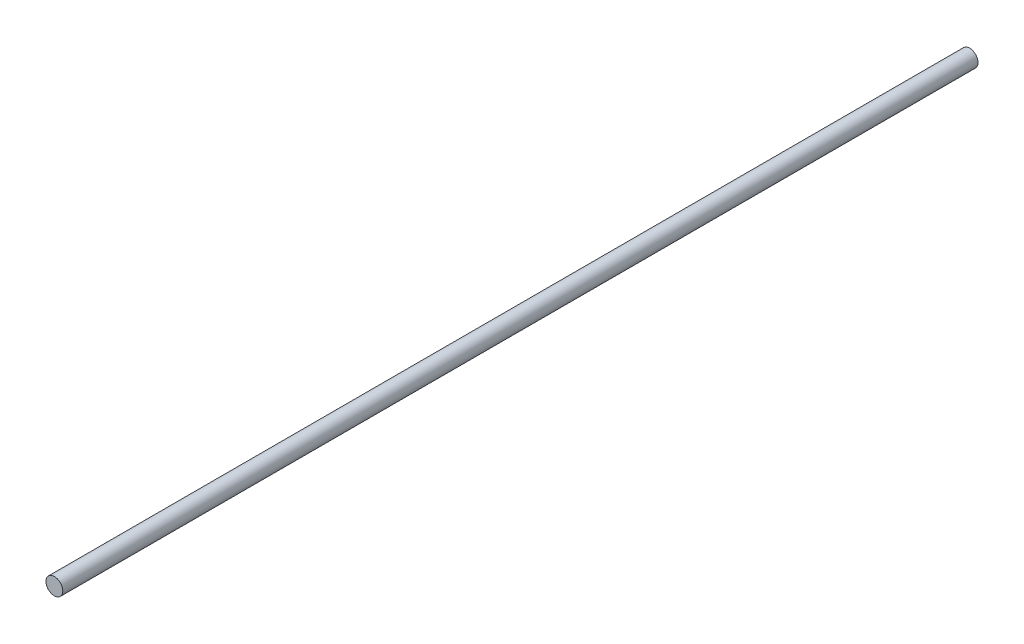
ISO-10303-21;
HEADER;
FILE_DESCRIPTION(('STEP AP214'),'2;1');
FILE_NAME('part.step','',(''),(''),'','','');
FILE_SCHEMA(('AUTOMOTIVE_DESIGN { 1 0 10303 214 1 1 1 1 }'));
ENDSEC;
DATA;
#1=APPLICATION_CONTEXT('core data for automotive mechanical design processes');
#2=APPLICATION_PROTOCOL_DEFINITION('international standard','automotive_design',2000,#1);
#3=PRODUCT_CONTEXT('',#1,'mechanical');
#4=PRODUCT('Part','Part','',(#3));
#5=PRODUCT_RELATED_PRODUCT_CATEGORY('part','',(#4));
#6=PRODUCT_DEFINITION_FORMATION('','',#4);
#7=PRODUCT_DEFINITION_CONTEXT('part definition',#1,'design');
#8=PRODUCT_DEFINITION('design','',#6,#7);
#9=PRODUCT_DEFINITION_SHAPE('','',#8);
#10=(LENGTH_UNIT() NAMED_UNIT(*) SI_UNIT(.MILLI.,.METRE.));
#11=(NAMED_UNIT(*) PLANE_ANGLE_UNIT() SI_UNIT($,.RADIAN.));
#12=(NAMED_UNIT(*) SI_UNIT($,.STERADIAN.) SOLID_ANGLE_UNIT());
#13=UNCERTAINTY_MEASURE_WITH_UNIT(LENGTH_MEASURE(1.E-05),#10,'distance_accuracy_value','');
#14=(GEOMETRIC_REPRESENTATION_CONTEXT(3) GLOBAL_UNCERTAINTY_ASSIGNED_CONTEXT((#13)) GLOBAL_UNIT_ASSIGNED_CONTEXT((#10,
#11,#12)) REPRESENTATION_CONTEXT('',''));
#15=CARTESIAN_POINT('',(0.,0.,0.));
#16=DIRECTION('',(0.,0.,1.));
#17=DIRECTION('',(1.,0.,0.));
#18=AXIS2_PLACEMENT_3D('',#15,#16,#17);
#19=CARTESIAN_POINT('',(0.,0.,436.));
#20=DIRECTION('',(0.,0.,-1.));
#21=DIRECTION('',(-1.,0.,0.));
#22=AXIS2_PLACEMENT_3D('',#19,#20,#21);
#23=CYLINDRICAL_SURFACE('',#22,4.);
#24=CARTESIAN_POINT('',(0.,0.,436.));
#25=DIRECTION('',(0.,0.,1.));
#26=DIRECTION('',(1.,0.,0.));
#27=AXIS2_PLACEMENT_3D('',#24,#25,#26);
#28=CIRCLE('',#27,4.);
#29=CARTESIAN_POINT('',(4.,0.,436.));
#30=VERTEX_POINT('',#29);
#31=EDGE_CURVE('E10',#30,#30,#28,.T.);
#32=ORIENTED_EDGE('',*,*,#31,.F.);
#33=EDGE_LOOP('',(#32));
#34=FACE_BOUND('',#33,.T.);
#35=CARTESIAN_POINT('',(0.,0.,0.));
#36=DIRECTION('',(0.,0.,1.));
#37=DIRECTION('',(1.,0.,0.));
#38=AXIS2_PLACEMENT_3D('',#35,#36,#37);
#39=CIRCLE('',#38,4.);
#40=CARTESIAN_POINT('',(4.,0.,0.));
#41=VERTEX_POINT('',#40);
#42=EDGE_CURVE('E40',#41,#41,#39,.T.);
#43=ORIENTED_EDGE('',*,*,#42,.T.);
#44=EDGE_LOOP('',(#43));
#45=FACE_BOUND('',#44,.T.);
#46=ADVANCED_FACE('F37',(#34,#45),#23,.T.);
#47=CARTESIAN_POINT('',(0.,0.,436.));
#48=DIRECTION('',(0.,0.,1.));
#49=DIRECTION('',(1.,0.,0.));
#50=AXIS2_PLACEMENT_3D('',#47,#48,#49);
#51=PLANE('',#50);
#52=ORIENTED_EDGE('',*,*,#31,.T.);
#53=EDGE_LOOP('',(#52));
#54=FACE_BOUND('',#53,.T.);
#55=ADVANCED_FACE('F54',(#54),#51,.T.);
#56=CARTESIAN_POINT('',(0.,0.,0.));
#57=DIRECTION('',(0.,0.,1.));
#58=DIRECTION('',(1.,0.,0.));
#59=AXIS2_PLACEMENT_3D('',#56,#57,#58);
#60=PLANE('',#59);
#61=ORIENTED_EDGE('',*,*,#42,.F.);
#62=EDGE_LOOP('',(#61));
#63=FACE_BOUND('',#62,.T.);
#64=ADVANCED_FACE('F52',(#63),#60,.F.);
#65=CLOSED_SHELL('',(#46,#55,#64));
#66=MANIFOLD_SOLID_BREP('B2',#65);
#67=ADVANCED_BREP_SHAPE_REPRESENTATION('',(#18,#66),#14);
#68=SHAPE_DEFINITION_REPRESENTATION(#9,#67);
ENDSEC;
END-ISO-10303-21;
